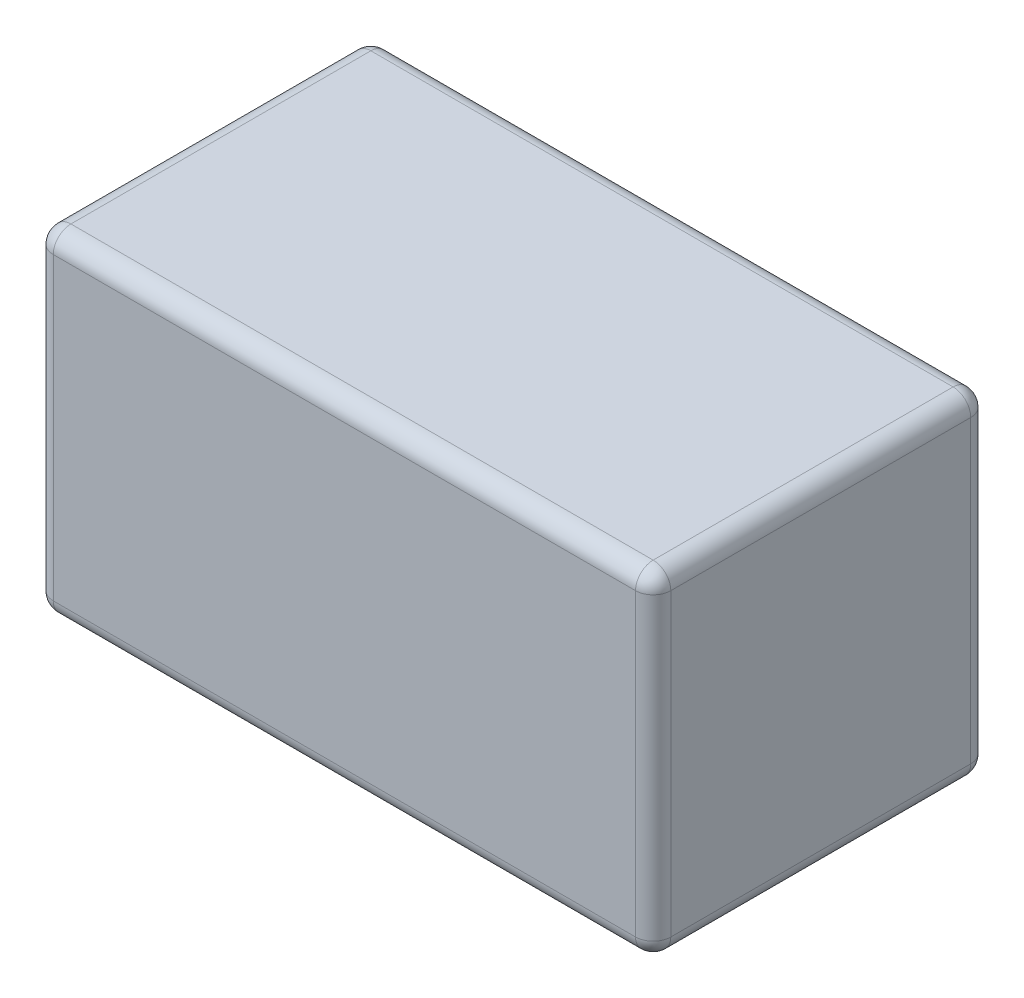
ISO-10303-21;
HEADER;
FILE_DESCRIPTION(('STEP AP214'),'2;1');
FILE_NAME('part.step','',(''),(''),'','','');
FILE_SCHEMA(('AUTOMOTIVE_DESIGN { 1 0 10303 214 1 1 1 1 }'));
ENDSEC;
DATA;
#1=APPLICATION_CONTEXT('core data for automotive mechanical design processes');
#2=APPLICATION_PROTOCOL_DEFINITION('international standard','automotive_design',2000,#1);
#3=PRODUCT_CONTEXT('',#1,'mechanical');
#4=PRODUCT('Part','Part','',(#3));
#5=PRODUCT_RELATED_PRODUCT_CATEGORY('part','',(#4));
#6=PRODUCT_DEFINITION_FORMATION('','',#4);
#7=PRODUCT_DEFINITION_CONTEXT('part definition',#1,'design');
#8=PRODUCT_DEFINITION('design','',#6,#7);
#9=PRODUCT_DEFINITION_SHAPE('','',#8);
#10=(LENGTH_UNIT() NAMED_UNIT(*) SI_UNIT(.MILLI.,.METRE.));
#11=(NAMED_UNIT(*) PLANE_ANGLE_UNIT() SI_UNIT($,.RADIAN.));
#12=(NAMED_UNIT(*) SI_UNIT($,.STERADIAN.) SOLID_ANGLE_UNIT());
#13=UNCERTAINTY_MEASURE_WITH_UNIT(LENGTH_MEASURE(1.E-05),#10,'distance_accuracy_value','');
#14=(GEOMETRIC_REPRESENTATION_CONTEXT(3) GLOBAL_UNCERTAINTY_ASSIGNED_CONTEXT((#13)) GLOBAL_UNIT_ASSIGNED_CONTEXT((#10,
#11,#12)) REPRESENTATION_CONTEXT('',''));
#15=CARTESIAN_POINT('',(0.,0.,0.));
#16=DIRECTION('',(0.,0.,1.));
#17=DIRECTION('',(1.,0.,0.));
#18=AXIS2_PLACEMENT_3D('',#15,#16,#17);
#19=CARTESIAN_POINT('',(-78.9792358276001,-3.64372261754231,4.90209601583195));
#20=DIRECTION('',(2.27536411647727E-06,0.999999999997407,-8.74770643127985E-08));
#21=DIRECTION('',(-0.0384169232059259,0.,-0.999261797534255));
#22=AXIS2_PLACEMENT_3D('',#19,#20,#21);
#23=PLANE('',#22);
#24=DIRECTION('',(4.96635298397137E-05,8.73640615914501E-08,0.999999998766763));
#25=VECTOR('',#24,1.);
#26=CARTESIAN_POINT('',(-77.279235829701,-3.64372648566869,4.90201158783156));
#27=LINE('',#26,#25);
#28=CARTESIAN_POINT('',(-77.2792333465245,-3.64372648130049,4.9520115877699));
#29=VERTEX_POINT('',#28);
#30=CARTESIAN_POINT('',(-77.2791911325241,-3.64372640704104,5.80201158672165));
#31=VERTEX_POINT('',#30);
#32=EDGE_CURVE('E21',#29,#31,#27,.T.);
#33=ORIENTED_EDGE('',*,*,#32,.T.);
#34=DIRECTION('',(0.999999998764178,-2.275368458091E-06,-4.96635296407999E-05));
#35=VECTOR('',#34,1.);
#36=CARTESIAN_POINT('',(-78.9791911304232,-3.64372253891466,5.80209601472203));
#37=LINE('',#36,#35);
#38=CARTESIAN_POINT('',(-78.929191130485,-3.64372265268308,5.80209353154555));
#39=VERTEX_POINT('',#38);
#40=EDGE_CURVE('E162',#39,#31,#37,.T.);
#41=ORIENTED_EDGE('',*,*,#40,.F.);
#42=DIRECTION('',(4.96635298397137E-05,8.73640615914501E-08,0.999999998766763));
#43=VECTOR('',#42,1.);
#44=CARTESIAN_POINT('',(-78.9292358276619,-3.64372273131074,4.90209353265547));
#45=LINE('',#44,#43);
#46=CARTESIAN_POINT('',(-78.9292333444854,-3.64372272694254,4.9520935325938));
#47=VERTEX_POINT('',#46);
#48=EDGE_CURVE('E174',#47,#39,#45,.T.);
#49=ORIENTED_EDGE('',*,*,#48,.F.);
#50=DIRECTION('',(0.999999998764178,-2.275368458091E-06,-4.96635296407999E-05));
#51=VECTOR('',#50,1.);
#52=CARTESIAN_POINT('',(-78.9792333444236,-3.64372261317411,4.95209601577029));
#53=LINE('',#52,#51);
#54=EDGE_CURVE('E11',#47,#29,#53,.T.);
#55=ORIENTED_EDGE('',*,*,#54,.T.);
#56=EDGE_LOOP('',(#33,#41,#49,#55));
#57=FACE_BOUND('',#56,.T.);
#58=ADVANCED_FACE('F17',(#57),#23,.F.);
#59=CARTESIAN_POINT('',(-78.9792332306554,-3.59372261317424,4.95209601139643));
#60=DIRECTION('',(0.999999998764178,-2.27536845809101E-06,-4.96635296407999E-05));
#61=DIRECTION('',(-2.27536411647765E-06,-0.999999999997407,8.74770568508096E-08));
#62=AXIS2_PLACEMENT_3D('',#59,#60,#61);
#63=CYLINDRICAL_SURFACE('',#62,0.05);
#64=DIRECTION('',(0.999999998764178,-2.275368458091E-06,-4.96635296407999E-05));
#65=VECTOR('',#64,1.);
#66=CARTESIAN_POINT('',(-78.9792357138319,-3.59372261754245,4.9020960114581));
#67=LINE('',#66,#65);
#68=CARTESIAN_POINT('',(-78.9292357138936,-3.59372273131087,4.90209352828161));
#69=VERTEX_POINT('',#68);
#70=CARTESIAN_POINT('',(-77.2792357159328,-3.59372648566882,4.90201158345771));
#71=VERTEX_POINT('',#70);
#72=EDGE_CURVE('E105',#69,#71,#67,.T.);
#73=ORIENTED_EDGE('',*,*,#72,.T.);
#74=CARTESIAN_POINT('',(-77.2792332327563,-3.59372648130062,4.95201158339604));
#75=DIRECTION('',(-0.999999998764178,2.27536845802977E-06,4.96635296407999E-05));
#76=DIRECTION('',(-2.27536411641641E-06,-0.999999999997407,8.74770568508067E-08));
#77=AXIS2_PLACEMENT_3D('',#74,#75,#76);
#78=CIRCLE('',#77,0.05);
#79=EDGE_CURVE('E104',#71,#29,#78,.T.);
#80=ORIENTED_EDGE('',*,*,#79,.T.);
#81=ORIENTED_EDGE('',*,*,#54,.F.);
#82=CARTESIAN_POINT('',(-78.9292332307172,-3.59372272694266,4.95209352821995));
#83=DIRECTION('',(-0.999999998764178,2.27536845815224E-06,4.96635296407999E-05));
#84=DIRECTION('',(-2.27536411653888E-06,-0.999999999997407,8.74770568508128E-08));
#85=AXIS2_PLACEMENT_3D('',#82,#83,#84);
#86=CIRCLE('',#85,0.05);
#87=EDGE_CURVE('E228',#69,#47,#86,.T.);
#88=ORIENTED_EDGE('',*,*,#87,.F.);
#89=EDGE_LOOP('',(#73,#80,#81,#88));
#90=FACE_BOUND('',#89,.T.);
#91=ADVANCED_FACE('F19',(#90),#63,.T.);
#92=CARTESIAN_POINT('',(-77.2792357159328,-3.59372648566882,4.90201158345771));
#93=DIRECTION('',(4.96635298397137E-05,8.73640615914502E-08,0.999999998766763));
#94=DIRECTION('',(0.999999998764178,-2.2753684613546E-06,-4.96635296407999E-05));
#95=AXIS2_PLACEMENT_3D('',#92,#93,#94);
#96=CYLINDRICAL_SURFACE('',#95,0.0500000000000017);
#97=CARTESIAN_POINT('',(-77.2791910187559,-3.59372640704117,5.80201158234779));
#98=DIRECTION('',(-4.96635298397137E-05,-8.73640615914502E-08,-0.999999998766763));
#99=DIRECTION('',(0.999999998764178,-2.2753684613546E-06,-4.96635296407999E-05));
#100=AXIS2_PLACEMENT_3D('',#97,#98,#99);
#101=CIRCLE('',#100,0.0500000000000017);
#102=CARTESIAN_POINT('',(-77.2291910188177,-3.59372652080959,5.80200909917131));
#103=VERTEX_POINT('',#102);
#104=EDGE_CURVE('E117',#103,#31,#101,.T.);
#105=ORIENTED_EDGE('',*,*,#104,.T.);
#106=ORIENTED_EDGE('',*,*,#32,.F.);
#107=CARTESIAN_POINT('',(-77.2792332327563,-3.59372648130062,4.95201158339604));
#108=DIRECTION('',(-4.96635298397137E-05,-8.73640615914502E-08,-0.999999998766763));
#109=DIRECTION('',(0.999999998764178,-2.2753684613546E-06,-4.96635296407999E-05));
#110=AXIS2_PLACEMENT_3D('',#107,#108,#109);
#111=CIRCLE('',#110,0.0500000000000017);
#112=CARTESIAN_POINT('',(-77.229233232818,-3.59372659506904,4.95200910021956));
#113=VERTEX_POINT('',#112);
#114=EDGE_CURVE('E94',#113,#29,#111,.T.);
#115=ORIENTED_EDGE('',*,*,#114,.F.);
#116=DIRECTION('',(4.96635298397137E-05,8.73640615914501E-08,0.999999998766763));
#117=VECTOR('',#116,1.);
#118=CARTESIAN_POINT('',(-77.2292357159945,-3.59372659943725,4.90200910028122));
#119=LINE('',#118,#117);
#120=EDGE_CURVE('E98',#113,#103,#119,.T.);
#121=ORIENTED_EDGE('',*,*,#120,.T.);
#122=EDGE_LOOP('',(#105,#106,#115,#121));
#123=FACE_BOUND('',#122,.T.);
#124=ADVANCED_FACE('F97',(#123),#96,.T.);
#125=CARTESIAN_POINT('',(-78.979191016655,-3.59372253891479,5.80209601034818));
#126=DIRECTION('',(0.999999998764178,-2.27536845809101E-06,-4.96635296407999E-05));
#127=DIRECTION('',(-2.27536411647765E-06,-0.999999999997407,8.74770568508096E-08));
#128=AXIS2_PLACEMENT_3D('',#125,#126,#127);
#129=CYLINDRICAL_SURFACE('',#128,0.05);
#130=ORIENTED_EDGE('',*,*,#40,.T.);
#131=CARTESIAN_POINT('',(-77.2791910187559,-3.59372640704117,5.80201158234779));
#132=DIRECTION('',(0.999999998764178,-2.27536845802977E-06,-4.96635296407999E-05));
#133=DIRECTION('',(-2.27536411641641E-06,-0.999999999997407,8.74770568508067E-08));
#134=AXIS2_PLACEMENT_3D('',#131,#132,#133);
#135=CIRCLE('',#134,0.05);
#136=CARTESIAN_POINT('',(-77.2791885355794,-3.59372640267296,5.85201158228613));
#137=VERTEX_POINT('',#136);
#138=EDGE_CURVE('E154',#137,#31,#135,.T.);
#139=ORIENTED_EDGE('',*,*,#138,.F.);
#140=DIRECTION('',(0.999999998764178,-2.275368458091E-06,-4.96635296407999E-05));
#141=VECTOR('',#140,1.);
#142=CARTESIAN_POINT('',(-78.9791885334785,-3.59372253454658,5.85209601028652));
#143=LINE('',#142,#141);
#144=CARTESIAN_POINT('',(-78.9291885335403,-3.59372264831501,5.85209352711004));
#145=VERTEX_POINT('',#144);
#146=EDGE_CURVE('E150',#145,#137,#143,.T.);
#147=ORIENTED_EDGE('',*,*,#146,.F.);
#148=CARTESIAN_POINT('',(-78.9291910167168,-3.59372265268321,5.8020935271717));
#149=DIRECTION('',(0.999999998764178,-2.27536845815224E-06,-4.96635296407999E-05));
#150=DIRECTION('',(-2.27536411653888E-06,-0.999999999997407,8.74770568508128E-08));
#151=AXIS2_PLACEMENT_3D('',#148,#149,#150);
#152=CIRCLE('',#151,0.05);
#153=EDGE_CURVE('E191',#145,#39,#152,.T.);
#154=ORIENTED_EDGE('',*,*,#153,.T.);
#155=EDGE_LOOP('',(#130,#139,#147,#154));
#156=FACE_BOUND('',#155,.T.);
#157=ADVANCED_FACE('F192',(#156),#129,.T.);
#158=CARTESIAN_POINT('',(-77.2792332327563,-3.59372648130062,4.95201158339604));
#159=DIRECTION('',(2.2753641815143E-06,0.999999999997407,-8.74770655912012E-08));
#160=DIRECTION('',(0.999999998764178,-2.2753685247068E-06,-4.96635296443065E-05));
#161=AXIS2_PLACEMENT_3D('',#158,#159,#160);
#162=SPHERICAL_SURFACE('',#161,0.05);
#163=ORIENTED_EDGE('',*,*,#114,.T.);
#164=ORIENTED_EDGE('',*,*,#79,.F.);
#165=CARTESIAN_POINT('',(-77.2792332327563,-3.59372648130062,4.95201158339604));
#166=DIRECTION('',(-2.27536411647727E-06,-0.999999999997407,8.74770643127984E-08));
#167=DIRECTION('',(0.999999998764178,-2.275368458091E-06,-4.96635296429165E-05));
#168=AXIS2_PLACEMENT_3D('',#165,#166,#167);
#169=CIRCLE('',#168,0.0500000000000017);
#170=EDGE_CURVE('E124',#71,#113,#169,.T.);
#171=ORIENTED_EDGE('',*,*,#170,.T.);
#172=EDGE_LOOP('',(#163,#164,#171));
#173=FACE_BOUND('',#172,.T.);
#174=ADVANCED_FACE('F131',(#173),#162,.T.);
#175=CARTESIAN_POINT('',(-78.9792358276001,-3.64372261754231,4.90209601583195));
#176=DIRECTION('',(4.96635298397137E-05,8.73640615914502E-08,0.999999998766763));
#177=DIRECTION('',(0.00175911633143453,-0.999998452753669,0.));
#178=AXIS2_PLACEMENT_3D('',#175,#176,#177);
#179=PLANE('',#178);
#180=DIRECTION('',(0.999999998764178,-2.275368458091E-06,-4.96635296407999E-05));
#181=VECTOR('',#180,1.);
#182=CARTESIAN_POINT('',(-78.9792337797724,-2.74372261754465,4.90209593710259));
#183=LINE('',#182,#181);
#184=CARTESIAN_POINT('',(-78.9292337798342,-2.74372273131307,4.90209345392611));
#185=VERTEX_POINT('',#184);
#186=CARTESIAN_POINT('',(-77.2792337818733,-2.74372648567103,4.9020115091022));
#187=VERTEX_POINT('',#186);
#188=EDGE_CURVE('E155',#185,#187,#183,.T.);
#189=ORIENTED_EDGE('',*,*,#188,.T.);
#190=DIRECTION('',(2.27536411647727E-06,0.999999999997408,-8.74770643127985E-08));
#191=VECTOR('',#190,1.);
#192=CARTESIAN_POINT('',(-77.279235829701,-3.64372648566869,4.90201158783156));
#193=LINE('',#192,#191);
#194=EDGE_CURVE('E129',#71,#187,#193,.T.);
#195=ORIENTED_EDGE('',*,*,#194,.F.);
#196=ORIENTED_EDGE('',*,*,#72,.F.);
#197=DIRECTION('',(2.27536411647727E-06,0.999999999997408,-8.74770643127985E-08));
#198=VECTOR('',#197,1.);
#199=CARTESIAN_POINT('',(-78.9292358276619,-3.64372273131074,4.90209353265547));
#200=LINE('',#199,#198);
#201=EDGE_CURVE('E237',#69,#185,#200,.T.);
#202=ORIENTED_EDGE('',*,*,#201,.T.);
#203=EDGE_LOOP('',(#189,#195,#196,#202));
#204=FACE_BOUND('',#203,.T.);
#205=ADVANCED_FACE('F506',(#204),#179,.F.);
#206=CARTESIAN_POINT('',(-77.2292358297628,-3.64372659943712,4.90200910465508));
#207=DIRECTION('',(0.999999998764178,-2.275368458091E-06,-4.96635296407999E-05));
#208=DIRECTION('',(0.,-0.998952111073725,0.0457676717929701));
#209=AXIS2_PLACEMENT_3D('',#206,#207,#208);
#210=PLANE('',#209);
#211=ORIENTED_EDGE('',*,*,#120,.F.);
#212=DIRECTION('',(2.27536411647727E-06,0.999999999997408,-8.74770643127985E-08));
#213=VECTOR('',#212,1.);
#214=CARTESIAN_POINT('',(-77.2292333465863,-3.64372659506891,4.95200910459341));
#215=LINE('',#214,#213);
#216=CARTESIAN_POINT('',(-77.2292312987585,-2.74372659507124,4.95200902586406));
#217=VERTEX_POINT('',#216);
#218=EDGE_CURVE('E112',#113,#217,#215,.T.);
#219=ORIENTED_EDGE('',*,*,#218,.T.);
#220=DIRECTION('',(4.96635298397137E-05,8.73640615914501E-08,0.999999998766763));
#221=VECTOR('',#220,1.);
#222=CARTESIAN_POINT('',(-77.2292337819351,-2.74372659943945,4.90200902592572));
#223=LINE('',#222,#221);
#224=CARTESIAN_POINT('',(-77.2291890847582,-2.7437265208118,5.80200902481581));
#225=VERTEX_POINT('',#224);
#226=EDGE_CURVE('E268',#217,#225,#223,.T.);
#227=ORIENTED_EDGE('',*,*,#226,.T.);
#228=DIRECTION('',(2.27536411647727E-06,0.999999999997408,-8.74770643127985E-08));
#229=VECTOR('',#228,1.);
#230=CARTESIAN_POINT('',(-77.2291911325859,-3.64372652080946,5.80200910354516));
#231=LINE('',#230,#229);
#232=EDGE_CURVE('E115',#103,#225,#231,.T.);
#233=ORIENTED_EDGE('',*,*,#232,.F.);
#234=EDGE_LOOP('',(#211,#219,#227,#233));
#235=FACE_BOUND('',#234,.T.);
#236=ADVANCED_FACE('F110',(#235),#210,.T.);
#237=CARTESIAN_POINT('',(-77.2791910187559,-3.59372640704117,5.80201158234779));
#238=DIRECTION('',(-2.2753641815143E-06,-0.999999999997407,8.74770655912012E-08));
#239=DIRECTION('',(0.999999998764178,-2.2753685247068E-06,-4.96635296443065E-05));
#240=AXIS2_PLACEMENT_3D('',#237,#238,#239);
#241=SPHERICAL_SURFACE('',#240,0.05);
#242=CARTESIAN_POINT('',(-77.2791910187559,-3.59372640704117,5.80201158234779));
#243=DIRECTION('',(2.27536411647727E-06,0.999999999997407,-8.74770643127984E-08));
#244=DIRECTION('',(0.999999998764178,-2.275368458091E-06,-4.96635296429165E-05));
#245=AXIS2_PLACEMENT_3D('',#242,#243,#244);
#246=CIRCLE('',#245,0.0500000000000017);
#247=EDGE_CURVE('E134',#137,#103,#246,.T.);
#248=ORIENTED_EDGE('',*,*,#247,.F.);
#249=ORIENTED_EDGE('',*,*,#138,.T.);
#250=ORIENTED_EDGE('',*,*,#104,.F.);
#251=EDGE_LOOP('',(#248,#249,#250));
#252=FACE_BOUND('',#251,.T.);
#253=ADVANCED_FACE('F706',(#252),#241,.T.);
#254=CARTESIAN_POINT('',(-78.9791886472467,-3.64372253454645,5.85209601466037));
#255=DIRECTION('',(4.96635298397137E-05,8.73640615914502E-08,0.999999998766763));
#256=DIRECTION('',(0.00175911633143453,-0.999998452753669,0.));
#257=AXIS2_PLACEMENT_3D('',#254,#255,#256);
#258=PLANE('',#257);
#259=ORIENTED_EDGE('',*,*,#146,.T.);
#260=DIRECTION('',(2.27536411647727E-06,0.999999999997408,-8.74770643127985E-08));
#261=VECTOR('',#260,1.);
#262=CARTESIAN_POINT('',(-77.2791886493476,-3.64372640267283,5.85201158665998));
#263=LINE('',#262,#261);
#264=CARTESIAN_POINT('',(-77.2791866015199,-2.74372640267517,5.85201150793063));
#265=VERTEX_POINT('',#264);
#266=EDGE_CURVE('E143',#137,#265,#263,.T.);
#267=ORIENTED_EDGE('',*,*,#266,.T.);
#268=DIRECTION('',(0.999999998764178,-2.275368458091E-06,-4.96635296407999E-05));
#269=VECTOR('',#268,1.);
#270=CARTESIAN_POINT('',(-78.979186599419,-2.74372253454879,5.85209593593102));
#271=LINE('',#270,#269);
#272=CARTESIAN_POINT('',(-78.9291865994808,-2.74372264831721,5.85209345275453));
#273=VERTEX_POINT('',#272);
#274=EDGE_CURVE('E213',#273,#265,#271,.T.);
#275=ORIENTED_EDGE('',*,*,#274,.F.);
#276=DIRECTION('',(2.27536411647727E-06,0.999999999997408,-8.74770643127985E-08));
#277=VECTOR('',#276,1.);
#278=CARTESIAN_POINT('',(-78.9291886473085,-3.64372264831488,5.85209353148389));
#279=LINE('',#278,#277);
#280=EDGE_CURVE('E233',#145,#273,#279,.T.);
#281=ORIENTED_EDGE('',*,*,#280,.F.);
#282=EDGE_LOOP('',(#259,#267,#275,#281));
#283=FACE_BOUND('',#282,.T.);
#284=ADVANCED_FACE('F283',(#283),#258,.T.);
#285=CARTESIAN_POINT('',(-78.9792312965959,-2.74372261317644,4.95209593704093));
#286=DIRECTION('',(0.999999998764178,-2.27536845809101E-06,-4.96635296407999E-05));
#287=DIRECTION('',(2.27536411647765E-06,0.999999999997407,-8.74770568508096E-08));
#288=AXIS2_PLACEMENT_3D('',#285,#286,#287);
#289=CYLINDRICAL_SURFACE('',#288,0.05);
#290=DIRECTION('',(0.999999998764178,-2.275368458091E-06,-4.96635296407999E-05));
#291=VECTOR('',#290,1.);
#292=CARTESIAN_POINT('',(-78.9792311828277,-2.69372261317657,4.95209593266708));
#293=LINE('',#292,#291);
#294=CARTESIAN_POINT('',(-78.9292311828895,-2.693722726945,4.95209344949059));
#295=VERTEX_POINT('',#294);
#296=CARTESIAN_POINT('',(-77.2792311849286,-2.69372648130295,4.95201150466669));
#297=VERTEX_POINT('',#296);
#298=EDGE_CURVE('E128',#295,#297,#293,.T.);
#299=ORIENTED_EDGE('',*,*,#298,.T.);
#300=CARTESIAN_POINT('',(-77.2792312986968,-2.74372648130282,4.95201150904054));
#301=DIRECTION('',(0.999999998764178,-2.27536845815224E-06,-4.96635296407999E-05));
#302=DIRECTION('',(2.27536411653888E-06,0.999999999997407,-8.74770568508128E-08));
#303=AXIS2_PLACEMENT_3D('',#300,#301,#302);
#304=CIRCLE('',#303,0.05);
#305=EDGE_CURVE('E225',#187,#297,#304,.T.);
#306=ORIENTED_EDGE('',*,*,#305,.F.);
#307=ORIENTED_EDGE('',*,*,#188,.F.);
#308=CARTESIAN_POINT('',(-78.9292312966577,-2.74372272694487,4.95209345386445));
#309=DIRECTION('',(0.999999998764178,-2.27536845802977E-06,-4.96635296407999E-05));
#310=DIRECTION('',(2.27536411641641E-06,0.999999999997407,-8.74770568508067E-08));
#311=AXIS2_PLACEMENT_3D('',#308,#309,#310);
#312=CIRCLE('',#311,0.05);
#313=EDGE_CURVE('E208',#185,#295,#312,.T.);
#314=ORIENTED_EDGE('',*,*,#313,.T.);
#315=EDGE_LOOP('',(#299,#306,#307,#314));
#316=FACE_BOUND('',#315,.T.);
#317=ADVANCED_FACE('F507',(#316),#289,.T.);
#318=CARTESIAN_POINT('',(-78.9791890825955,-2.743722538917,5.80209593599268));
#319=DIRECTION('',(0.999999998764178,-2.27536845809101E-06,-4.96635296407999E-05));
#320=DIRECTION('',(2.27536411647765E-06,0.999999999997407,-8.74770568508096E-08));
#321=AXIS2_PLACEMENT_3D('',#318,#319,#320);
#322=CYLINDRICAL_SURFACE('',#321,0.05);
#323=DIRECTION('',(0.999999998764178,-2.275368458091E-06,-4.96635296407999E-05));
#324=VECTOR('',#323,1.);
#325=CARTESIAN_POINT('',(-78.9791889688273,-2.69372253891712,5.80209593161882));
#326=LINE('',#325,#324);
#327=CARTESIAN_POINT('',(-78.9291889688891,-2.69372265268554,5.80209344844234));
#328=VERTEX_POINT('',#327);
#329=CARTESIAN_POINT('',(-77.2791889709282,-2.6937264070435,5.80201150361844));
#330=VERTEX_POINT('',#329);
#331=EDGE_CURVE('E149',#328,#330,#326,.T.);
#332=ORIENTED_EDGE('',*,*,#331,.F.);
#333=CARTESIAN_POINT('',(-78.9291890826573,-2.74372265268542,5.80209345281619));
#334=DIRECTION('',(0.999999998764178,-2.27536845809101E-06,-4.96635296407386E-05));
#335=DIRECTION('',(4.96635298396524E-05,8.73640656348505E-08,0.999999998766763));
#336=AXIS2_PLACEMENT_3D('',#333,#334,#335);
#337=CIRCLE('',#336,0.05);
#338=EDGE_CURVE('E359',#328,#273,#337,.T.);
#339=ORIENTED_EDGE('',*,*,#338,.T.);
#340=ORIENTED_EDGE('',*,*,#274,.T.);
#341=CARTESIAN_POINT('',(-77.2791890846964,-2.74372640704337,5.80201150799229));
#342=DIRECTION('',(0.999999998764178,-2.27536845809101E-06,-4.96635296408611E-05));
#343=DIRECTION('',(4.96635298397749E-05,8.73640656348502E-08,0.999999998766763));
#344=AXIS2_PLACEMENT_3D('',#341,#342,#343);
#345=CIRCLE('',#344,0.05);
#346=EDGE_CURVE('E252',#330,#265,#345,.T.);
#347=ORIENTED_EDGE('',*,*,#346,.F.);
#348=EDGE_LOOP('',(#332,#339,#340,#347));
#349=FACE_BOUND('',#348,.T.);
#350=ADVANCED_FACE('F296',(#349),#322,.T.);
#351=CARTESIAN_POINT('',(-78.9792336660041,-2.69372261754478,4.90209593272874));
#352=DIRECTION('',(2.27536411647727E-06,0.999999999997407,-8.74770643127985E-08));
#353=DIRECTION('',(-0.0384169232059259,0.,-0.999261797534255));
#354=AXIS2_PLACEMENT_3D('',#351,#352,#353);
#355=PLANE('',#354);
#356=ORIENTED_EDGE('',*,*,#298,.F.);
#357=DIRECTION('',(4.96635298397137E-05,8.73640615914501E-08,0.999999998766763));
#358=VECTOR('',#357,1.);
#359=CARTESIAN_POINT('',(-78.9292336660659,-2.6937227313132,4.90209344955225));
#360=LINE('',#359,#358);
#361=EDGE_CURVE('E215',#295,#328,#360,.T.);
#362=ORIENTED_EDGE('',*,*,#361,.T.);
#363=ORIENTED_EDGE('',*,*,#331,.T.);
#364=DIRECTION('',(4.96635298397137E-05,8.73640615914501E-08,0.999999998766763));
#365=VECTOR('',#364,1.);
#366=CARTESIAN_POINT('',(-77.2792336681051,-2.69372648567116,4.90201150472835));
#367=LINE('',#366,#365);
#368=EDGE_CURVE('E271',#297,#330,#367,.T.);
#369=ORIENTED_EDGE('',*,*,#368,.F.);
#370=EDGE_LOOP('',(#356,#362,#363,#369));
#371=FACE_BOUND('',#370,.T.);
#372=ADVANCED_FACE('F513',(#371),#355,.T.);
#373=CARTESIAN_POINT('',(-77.2792333465245,-3.64372648130049,4.9520115877699));
#374=DIRECTION('',(2.27536411647727E-06,0.999999999997407,-8.74770643127984E-08));
#375=DIRECTION('',(0.999999998764178,-2.275368458091E-06,-4.96635296429165E-05));
#376=AXIS2_PLACEMENT_3D('',#373,#374,#375);
#377=CYLINDRICAL_SURFACE('',#376,0.0500000000000017);
#378=ORIENTED_EDGE('',*,*,#170,.F.);
#379=ORIENTED_EDGE('',*,*,#194,.T.);
#380=CARTESIAN_POINT('',(-77.2792312986968,-2.74372648130282,4.95201150904054));
#381=DIRECTION('',(-2.27536411647727E-06,-0.999999999997407,8.74770643127984E-08));
#382=DIRECTION('',(0.999999998764178,-2.275368458091E-06,-4.96635296429165E-05));
#383=AXIS2_PLACEMENT_3D('',#380,#381,#382);
#384=CIRCLE('',#383,0.0500000000000017);
#385=EDGE_CURVE('E126',#187,#217,#384,.T.);
#386=ORIENTED_EDGE('',*,*,#385,.T.);
#387=ORIENTED_EDGE('',*,*,#218,.F.);
#388=EDGE_LOOP('',(#378,#379,#386,#387));
#389=FACE_BOUND('',#388,.T.);
#390=ADVANCED_FACE('F122',(#389),#377,.T.);
#391=CARTESIAN_POINT('',(-77.2791911325241,-3.64372640704104,5.80201158672165));
#392=DIRECTION('',(2.27536411647727E-06,0.999999999997407,-8.74770643127984E-08));
#393=DIRECTION('',(0.999999998764178,-2.275368458091E-06,-4.96635296429165E-05));
#394=AXIS2_PLACEMENT_3D('',#391,#392,#393);
#395=CYLINDRICAL_SURFACE('',#394,0.0500000000000017);
#396=ORIENTED_EDGE('',*,*,#232,.T.);
#397=CARTESIAN_POINT('',(-77.2791890846964,-2.74372640704337,5.80201150799229));
#398=DIRECTION('',(-2.27536411647727E-06,-0.999999999997407,8.74770643127984E-08));
#399=DIRECTION('',(0.999999998764178,-2.275368458091E-06,-4.96635296429165E-05));
#400=AXIS2_PLACEMENT_3D('',#397,#398,#399);
#401=CIRCLE('',#400,0.0500000000000017);
#402=EDGE_CURVE('E226',#225,#265,#401,.T.);
#403=ORIENTED_EDGE('',*,*,#402,.T.);
#404=ORIENTED_EDGE('',*,*,#266,.F.);
#405=ORIENTED_EDGE('',*,*,#247,.T.);
#406=EDGE_LOOP('',(#396,#403,#404,#405));
#407=FACE_BOUND('',#406,.T.);
#408=ADVANCED_FACE('F289',(#407),#395,.T.);
#409=CARTESIAN_POINT('',(-77.2792337818733,-2.74372648567103,4.9020115091022));
#410=DIRECTION('',(4.96635298397137E-05,8.73640615914502E-08,0.999999998766763));
#411=DIRECTION('',(0.999999998764178,-2.2753684613546E-06,-4.96635296407999E-05));
#412=AXIS2_PLACEMENT_3D('',#409,#410,#411);
#413=CYLINDRICAL_SURFACE('',#412,0.0500000000000017);
#414=ORIENTED_EDGE('',*,*,#226,.F.);
#415=CARTESIAN_POINT('',(-77.2792312986968,-2.74372648130282,4.95201150904054));
#416=DIRECTION('',(4.96635298397137E-05,8.73640615914502E-08,0.999999998766763));
#417=DIRECTION('',(0.999999998764178,-2.2753684613546E-06,-4.96635296407999E-05));
#418=AXIS2_PLACEMENT_3D('',#415,#416,#417);
#419=CIRCLE('',#418,0.0500000000000017);
#420=EDGE_CURVE('E264',#217,#297,#419,.T.);
#421=ORIENTED_EDGE('',*,*,#420,.T.);
#422=ORIENTED_EDGE('',*,*,#368,.T.);
#423=CARTESIAN_POINT('',(-77.2791890846964,-2.74372640704337,5.80201150799229));
#424=DIRECTION('',(-4.96635298397137E-05,-8.73640615914502E-08,-0.999999998766763));
#425=DIRECTION('',(0.999999998764178,-2.2753684613546E-06,-4.96635296407999E-05));
#426=AXIS2_PLACEMENT_3D('',#423,#424,#425);
#427=CIRCLE('',#426,0.0500000000000017);
#428=EDGE_CURVE('E187',#330,#225,#427,.T.);
#429=ORIENTED_EDGE('',*,*,#428,.T.);
#430=EDGE_LOOP('',(#414,#421,#422,#429));
#431=FACE_BOUND('',#430,.T.);
#432=ADVANCED_FACE('F512',(#431),#413,.T.);
#433=CARTESIAN_POINT('',(-77.2792312986968,-2.74372648130282,4.95201150904054));
#434=DIRECTION('',(2.2753641815143E-06,0.999999999997407,-8.74770655912012E-08));
#435=DIRECTION('',(0.999999998764178,-2.2753685247068E-06,-4.96635296443065E-05));
#436=AXIS2_PLACEMENT_3D('',#433,#434,#435);
#437=SPHERICAL_SURFACE('',#436,0.05);
#438=ORIENTED_EDGE('',*,*,#385,.F.);
#439=ORIENTED_EDGE('',*,*,#305,.T.);
#440=ORIENTED_EDGE('',*,*,#420,.F.);
#441=EDGE_LOOP('',(#438,#439,#440));
#442=FACE_BOUND('',#441,.T.);
#443=ADVANCED_FACE('F510',(#442),#437,.T.);
#444=CARTESIAN_POINT('',(-77.2791890846964,-2.74372640704337,5.80201150799229));
#445=DIRECTION('',(4.96635297508875E-05,8.73640626508634E-08,0.999999998766763));
#446=DIRECTION('',(0.999999998764178,-2.27536846253431E-06,-4.96635295554887E-05));
#447=AXIS2_PLACEMENT_3D('',#444,#445,#446);
#448=SPHERICAL_SURFACE('',#447,0.05);
#449=ORIENTED_EDGE('',*,*,#428,.F.);
#450=ORIENTED_EDGE('',*,*,#346,.T.);
#451=ORIENTED_EDGE('',*,*,#402,.F.);
#452=EDGE_LOOP('',(#449,#450,#451));
#453=FACE_BOUND('',#452,.T.);
#454=ADVANCED_FACE('F293',(#453),#448,.T.);
#455=CARTESIAN_POINT('',(-78.9792358276001,-3.64372261754231,4.90209601583195));
#456=DIRECTION('',(0.999999998764178,-2.275368458091E-06,-4.96635296407999E-05));
#457=DIRECTION('',(0.,-0.998952111073725,0.0457676717929701));
#458=AXIS2_PLACEMENT_3D('',#455,#456,#457);
#459=PLANE('',#458);
#460=DIRECTION('',(2.27536411647727E-06,0.999999999997408,-8.74770643127985E-08));
#461=VECTOR('',#460,1.);
#462=CARTESIAN_POINT('',(-78.9791911304232,-3.64372253891466,5.80209601472203));
#463=LINE('',#462,#461);
#464=CARTESIAN_POINT('',(-78.979191016655,-3.59372253891479,5.80209601034818));
#465=VERTEX_POINT('',#464);
#466=CARTESIAN_POINT('',(-78.9791890825955,-2.743722538917,5.80209593599268));
#467=VERTEX_POINT('',#466);
#468=EDGE_CURVE('E238',#465,#467,#463,.T.);
#469=ORIENTED_EDGE('',*,*,#468,.T.);
#470=DIRECTION('',(4.96635298397137E-05,8.73640615914501E-08,0.999999998766763));
#471=VECTOR('',#470,1.);
#472=CARTESIAN_POINT('',(-78.9792337797724,-2.74372261754465,4.90209593710259));
#473=LINE('',#472,#471);
#474=CARTESIAN_POINT('',(-78.9792312965959,-2.74372261317644,4.95209593704093));
#475=VERTEX_POINT('',#474);
#476=EDGE_CURVE('E219',#475,#467,#473,.T.);
#477=ORIENTED_EDGE('',*,*,#476,.F.);
#478=DIRECTION('',(2.27536411647727E-06,0.999999999997408,-8.74770643127985E-08));
#479=VECTOR('',#478,1.);
#480=CARTESIAN_POINT('',(-78.9792333444236,-3.64372261317411,4.95209601577029));
#481=LINE('',#480,#479);
#482=CARTESIAN_POINT('',(-78.9792332306554,-3.59372261317424,4.95209601139643));
#483=VERTEX_POINT('',#482);
#484=EDGE_CURVE('E242',#483,#475,#481,.T.);
#485=ORIENTED_EDGE('',*,*,#484,.F.);
#486=DIRECTION('',(4.96635298397137E-05,8.73640615914501E-08,0.999999998766763));
#487=VECTOR('',#486,1.);
#488=CARTESIAN_POINT('',(-78.9792357138319,-3.59372261754245,4.9020960114581));
#489=LINE('',#488,#487);
#490=EDGE_CURVE('E188',#483,#465,#489,.T.);
#491=ORIENTED_EDGE('',*,*,#490,.T.);
#492=EDGE_LOOP('',(#469,#477,#485,#491));
#493=FACE_BOUND('',#492,.T.);
#494=ADVANCED_FACE('F343',(#493),#459,.F.);
#495=CARTESIAN_POINT('',(-78.9292357138936,-3.59372273131087,4.90209352828161));
#496=DIRECTION('',(4.96635298397137E-05,8.73640615914502E-08,0.999999998766763));
#497=DIRECTION('',(-0.999999998764178,2.2753684613546E-06,4.96635296407999E-05));
#498=AXIS2_PLACEMENT_3D('',#495,#496,#497);
#499=CYLINDRICAL_SURFACE('',#498,0.0500000000000017);
#500=ORIENTED_EDGE('',*,*,#490,.F.);
#501=CARTESIAN_POINT('',(-78.9292332307172,-3.59372272694266,4.95209352821995));
#502=DIRECTION('',(4.96635298397137E-05,8.73640615914502E-08,0.999999998766763));
#503=DIRECTION('',(-0.999999998764178,2.2753684613546E-06,4.96635296407999E-05));
#504=AXIS2_PLACEMENT_3D('',#501,#502,#503);
#505=CIRCLE('',#504,0.0500000000000017);
#506=EDGE_CURVE('E184',#483,#47,#505,.T.);
#507=ORIENTED_EDGE('',*,*,#506,.T.);
#508=ORIENTED_EDGE('',*,*,#48,.T.);
#509=CARTESIAN_POINT('',(-78.9291910167168,-3.59372265268321,5.8020935271717));
#510=DIRECTION('',(4.96635298397137E-05,8.73640615914502E-08,0.999999998766763));
#511=DIRECTION('',(-0.999999998764178,2.2753684613546E-06,4.96635296407999E-05));
#512=AXIS2_PLACEMENT_3D('',#509,#510,#511);
#513=CIRCLE('',#512,0.0500000000000017);
#514=EDGE_CURVE('E182',#465,#39,#513,.T.);
#515=ORIENTED_EDGE('',*,*,#514,.F.);
#516=EDGE_LOOP('',(#500,#507,#508,#515));
#517=FACE_BOUND('',#516,.T.);
#518=ADVANCED_FACE('F180',(#517),#499,.T.);
#519=CARTESIAN_POINT('',(-78.9292333444854,-3.64372272694254,4.9520935325938));
#520=DIRECTION('',(2.27536411647727E-06,0.999999999997407,-8.74770643127984E-08));
#521=DIRECTION('',(-0.999999998764178,2.275368458091E-06,4.96635296429165E-05));
#522=AXIS2_PLACEMENT_3D('',#519,#520,#521);
#523=CYLINDRICAL_SURFACE('',#522,0.0500000000000017);
#524=ORIENTED_EDGE('',*,*,#484,.T.);
#525=CARTESIAN_POINT('',(-78.9292312966577,-2.74372272694487,4.95209345386445));
#526=DIRECTION('',(2.27536411647727E-06,0.999999999997407,-8.74770643127984E-08));
#527=DIRECTION('',(-0.999999998764178,2.275368458091E-06,4.96635296429165E-05));
#528=AXIS2_PLACEMENT_3D('',#525,#526,#527);
#529=CIRCLE('',#528,0.0500000000000017);
#530=EDGE_CURVE('E202',#185,#475,#529,.T.);
#531=ORIENTED_EDGE('',*,*,#530,.F.);
#532=ORIENTED_EDGE('',*,*,#201,.F.);
#533=CARTESIAN_POINT('',(-78.9292332307172,-3.59372272694266,4.95209352821995));
#534=DIRECTION('',(2.27536411647727E-06,0.999999999997407,-8.74770643127984E-08));
#535=DIRECTION('',(-0.999999998764178,2.275368458091E-06,4.96635296429165E-05));
#536=AXIS2_PLACEMENT_3D('',#533,#534,#535);
#537=CIRCLE('',#536,0.0500000000000017);
#538=EDGE_CURVE('E222',#69,#483,#537,.T.);
#539=ORIENTED_EDGE('',*,*,#538,.T.);
#540=EDGE_LOOP('',(#524,#531,#532,#539));
#541=FACE_BOUND('',#540,.T.);
#542=ADVANCED_FACE('F533',(#541),#523,.T.);
#543=CARTESIAN_POINT('',(-78.929191130485,-3.64372265268308,5.80209353154555));
#544=DIRECTION('',(2.27536411647727E-06,0.999999999997407,-8.74770643127984E-08));
#545=DIRECTION('',(-0.999999998764178,2.275368458091E-06,4.96635296429165E-05));
#546=AXIS2_PLACEMENT_3D('',#543,#544,#545);
#547=CYLINDRICAL_SURFACE('',#546,0.0500000000000017);
#548=CARTESIAN_POINT('',(-78.9291910167168,-3.59372265268321,5.8020935271717));
#549=DIRECTION('',(-2.27536411647727E-06,-0.999999999997407,8.74770643127984E-08));
#550=DIRECTION('',(-0.999999998764178,2.275368458091E-06,4.96635296429165E-05));
#551=AXIS2_PLACEMENT_3D('',#548,#549,#550);
#552=CIRCLE('',#551,0.0500000000000017);
#553=EDGE_CURVE('E197',#145,#465,#552,.T.);
#554=ORIENTED_EDGE('',*,*,#553,.F.);
#555=ORIENTED_EDGE('',*,*,#280,.T.);
#556=CARTESIAN_POINT('',(-78.9291890826573,-2.74372265268542,5.80209345281619));
#557=DIRECTION('',(2.27536411647727E-06,0.999999999997407,-8.74770643127984E-08));
#558=DIRECTION('',(-0.999999998764178,2.275368458091E-06,4.96635296429165E-05));
#559=AXIS2_PLACEMENT_3D('',#556,#557,#558);
#560=CIRCLE('',#559,0.0500000000000017);
#561=EDGE_CURVE('E358',#467,#273,#560,.T.);
#562=ORIENTED_EDGE('',*,*,#561,.F.);
#563=ORIENTED_EDGE('',*,*,#468,.F.);
#564=EDGE_LOOP('',(#554,#555,#562,#563));
#565=FACE_BOUND('',#564,.T.);
#566=ADVANCED_FACE('F362',(#565),#547,.T.);
#567=CARTESIAN_POINT('',(-78.9292337798342,-2.74372273131307,4.90209345392611));
#568=DIRECTION('',(4.96635298397137E-05,8.73640615914502E-08,0.999999998766763));
#569=DIRECTION('',(-0.999999998764178,2.2753684613546E-06,4.96635296407999E-05));
#570=AXIS2_PLACEMENT_3D('',#567,#568,#569);
#571=CYLINDRICAL_SURFACE('',#570,0.0500000000000017);
#572=CARTESIAN_POINT('',(-78.9291890826573,-2.74372265268542,5.80209345281619));
#573=DIRECTION('',(4.96635298397137E-05,8.73640615914502E-08,0.999999998766763));
#574=DIRECTION('',(-0.999999998764178,2.2753684613546E-06,4.96635296407999E-05));
#575=AXIS2_PLACEMENT_3D('',#572,#573,#574);
#576=CIRCLE('',#575,0.0500000000000017);
#577=EDGE_CURVE('E351',#328,#467,#576,.T.);
#578=ORIENTED_EDGE('',*,*,#577,.F.);
#579=ORIENTED_EDGE('',*,*,#361,.F.);
#580=CARTESIAN_POINT('',(-78.9292312966577,-2.74372272694487,4.95209345386445));
#581=DIRECTION('',(-4.96635298397137E-05,-8.73640615914502E-08,-0.999999998766763));
#582=DIRECTION('',(-0.999999998764178,2.2753684613546E-06,4.96635296407999E-05));
#583=AXIS2_PLACEMENT_3D('',#580,#581,#582);
#584=CIRCLE('',#583,0.0500000000000017);
#585=EDGE_CURVE('E354',#475,#295,#584,.T.);
#586=ORIENTED_EDGE('',*,*,#585,.F.);
#587=ORIENTED_EDGE('',*,*,#476,.T.);
#588=EDGE_LOOP('',(#578,#579,#586,#587));
#589=FACE_BOUND('',#588,.T.);
#590=ADVANCED_FACE('F350',(#589),#571,.T.);
#591=CARTESIAN_POINT('',(-78.9292332307172,-3.59372272694266,4.95209352821995));
#592=DIRECTION('',(-2.2753641815143E-06,-0.999999999997407,8.74770655912012E-08));
#593=DIRECTION('',(-0.999999998764178,2.2753685247068E-06,4.96635296443065E-05));
#594=AXIS2_PLACEMENT_3D('',#591,#592,#593);
#595=SPHERICAL_SURFACE('',#594,0.05);
#596=ORIENTED_EDGE('',*,*,#538,.F.);
#597=ORIENTED_EDGE('',*,*,#87,.T.);
#598=ORIENTED_EDGE('',*,*,#506,.F.);
#599=EDGE_LOOP('',(#596,#597,#598));
#600=FACE_BOUND('',#599,.T.);
#601=ADVANCED_FACE('F501',(#600),#595,.T.);
#602=CARTESIAN_POINT('',(-78.9291910167168,-3.59372265268321,5.8020935271717));
#603=DIRECTION('',(2.2753641815143E-06,0.999999999997407,-8.74770655912012E-08));
#604=DIRECTION('',(-0.999999998764178,2.2753685247068E-06,4.96635296443065E-05));
#605=AXIS2_PLACEMENT_3D('',#602,#603,#604);
#606=SPHERICAL_SURFACE('',#605,0.05);
#607=ORIENTED_EDGE('',*,*,#514,.T.);
#608=ORIENTED_EDGE('',*,*,#153,.F.);
#609=ORIENTED_EDGE('',*,*,#553,.T.);
#610=EDGE_LOOP('',(#607,#608,#609));
#611=FACE_BOUND('',#610,.T.);
#612=ADVANCED_FACE('F199',(#611),#606,.T.);
#613=CARTESIAN_POINT('',(-78.9292312966577,-2.74372272694487,4.95209345386445));
#614=DIRECTION('',(-2.2753641815143E-06,-0.999999999997407,8.74770655912012E-08));
#615=DIRECTION('',(-0.999999998764178,2.2753685247068E-06,4.96635296443065E-05));
#616=AXIS2_PLACEMENT_3D('',#613,#614,#615);
#617=SPHERICAL_SURFACE('',#616,0.05);
#618=ORIENTED_EDGE('',*,*,#585,.T.);
#619=ORIENTED_EDGE('',*,*,#313,.F.);
#620=ORIENTED_EDGE('',*,*,#530,.T.);
#621=EDGE_LOOP('',(#618,#619,#620));
#622=FACE_BOUND('',#621,.T.);
#623=ADVANCED_FACE('F534',(#622),#617,.T.);
#624=CARTESIAN_POINT('',(-78.9291890826573,-2.74372265268542,5.80209345281619));
#625=DIRECTION('',(-4.96635297508875E-05,-8.73640626508634E-08,-0.999999998766763));
#626=DIRECTION('',(-0.999999998764178,2.27536846253431E-06,4.96635295554887E-05));
#627=AXIS2_PLACEMENT_3D('',#624,#625,#626);
#628=SPHERICAL_SURFACE('',#627,0.05);
#629=ORIENTED_EDGE('',*,*,#561,.T.);
#630=ORIENTED_EDGE('',*,*,#338,.F.);
#631=ORIENTED_EDGE('',*,*,#577,.T.);
#632=EDGE_LOOP('',(#629,#630,#631));
#633=FACE_BOUND('',#632,.T.);
#634=ADVANCED_FACE('F357',(#633),#628,.T.);
#635=CLOSED_SHELL('',(#58,#91,#124,#157,#174,#205,#236,#253,#284,#317,#350,#372,#390,#408,#432,
#443,#454,#494,#518,#542,#566,#590,#601,#612,#623,#634));
#636=MANIFOLD_SOLID_BREP('B1',#635);
#637=ADVANCED_BREP_SHAPE_REPRESENTATION('',(#18,#636),#14);
#638=SHAPE_DEFINITION_REPRESENTATION(#9,#637);
ENDSEC;
END-ISO-10303-21;
